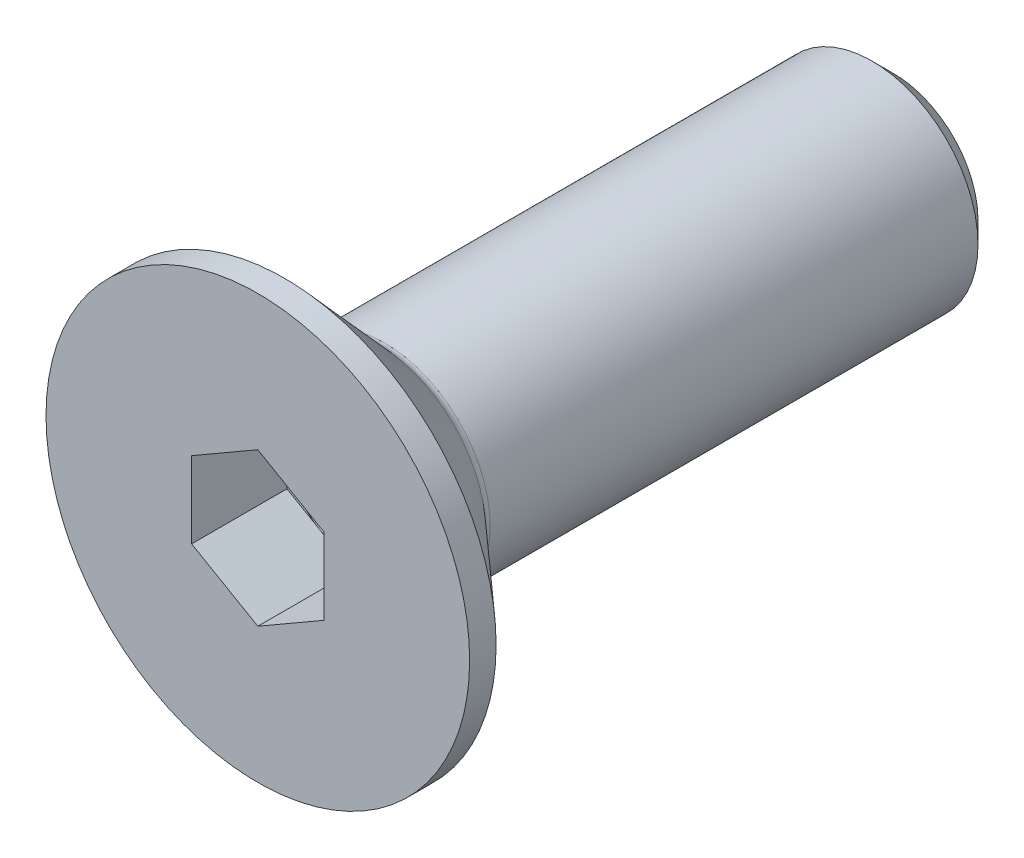
ISO-10303-21;
HEADER;
FILE_DESCRIPTION(('STEP AP214'),'2;1');
FILE_NAME('part.step','',(''),(''),'','','');
FILE_SCHEMA(('AUTOMOTIVE_DESIGN { 1 0 10303 214 1 1 1 1 }'));
ENDSEC;
DATA;
#1=APPLICATION_CONTEXT('core data for automotive mechanical design processes');
#2=APPLICATION_PROTOCOL_DEFINITION('international standard','automotive_design',2000,#1);
#3=PRODUCT_CONTEXT('',#1,'mechanical');
#4=PRODUCT('Part','Part','',(#3));
#5=PRODUCT_RELATED_PRODUCT_CATEGORY('part','',(#4));
#6=PRODUCT_DEFINITION_FORMATION('','',#4);
#7=PRODUCT_DEFINITION_CONTEXT('part definition',#1,'design');
#8=PRODUCT_DEFINITION('design','',#6,#7);
#9=PRODUCT_DEFINITION_SHAPE('','',#8);
#10=(LENGTH_UNIT() NAMED_UNIT(*) SI_UNIT(.MILLI.,.METRE.));
#11=(NAMED_UNIT(*) PLANE_ANGLE_UNIT() SI_UNIT($,.RADIAN.));
#12=(NAMED_UNIT(*) SI_UNIT($,.STERADIAN.) SOLID_ANGLE_UNIT());
#13=UNCERTAINTY_MEASURE_WITH_UNIT(LENGTH_MEASURE(1.E-05),#10,'distance_accuracy_value','');
#14=(GEOMETRIC_REPRESENTATION_CONTEXT(3) GLOBAL_UNCERTAINTY_ASSIGNED_CONTEXT((#13)) GLOBAL_UNIT_ASSIGNED_CONTEXT((#10,
#11,#12)) REPRESENTATION_CONTEXT('',''));
#15=CARTESIAN_POINT('',(0.,0.,0.));
#16=DIRECTION('',(0.,0.,1.));
#17=DIRECTION('',(1.,0.,0.));
#18=AXIS2_PLACEMENT_3D('',#15,#16,#17);
#19=CARTESIAN_POINT('',(-1.25,-0.721687836487032,-1.8));
#20=DIRECTION('',(0.,0.,1.));
#21=DIRECTION('',(1.,0.,0.));
#22=AXIS2_PLACEMENT_3D('',#19,#20,#21);
#23=PLANE('',#22);
#24=CARTESIAN_POINT('',(0.,0.,-1.8));
#25=DIRECTION('',(0.,0.,1.));
#26=DIRECTION('',(1.,0.,0.));
#27=AXIS2_PLACEMENT_3D('',#24,#25,#26);
#28=CIRCLE('',#27,1.25);
#29=CARTESIAN_POINT('',(1.25,0.,-1.8));
#30=VERTEX_POINT('',#29);
#31=CARTESIAN_POINT('',(0.624999999999999,1.08253175473055,-1.8));
#32=VERTEX_POINT('',#31);
#33=EDGE_CURVE('E112',#30,#32,#28,.T.);
#34=ORIENTED_EDGE('',*,*,#33,.F.);
#35=DIRECTION('',(0.,1.,0.));
#36=VECTOR('',#35,1.);
#37=CARTESIAN_POINT('',(1.25,-0.721687836487032,-1.8));
#38=LINE('',#37,#36);
#39=CARTESIAN_POINT('',(1.25,0.721687836487033,-1.8));
#40=VERTEX_POINT('',#39);
#41=EDGE_CURVE('E139',#30,#40,#38,.T.);
#42=ORIENTED_EDGE('',*,*,#41,.T.);
#43=DIRECTION('',(-0.866025403784439,0.5,0.));
#44=VECTOR('',#43,1.);
#45=CARTESIAN_POINT('',(1.25,0.721687836487033,-1.8));
#46=LINE('',#45,#44);
#47=EDGE_CURVE('E135',#40,#32,#46,.T.);
#48=ORIENTED_EDGE('',*,*,#47,.T.);
#49=EDGE_LOOP('',(#34,#42,#48));
#50=FACE_BOUND('',#49,.T.);
#51=ADVANCED_FACE('F34',(#50),#23,.T.);
#52=CARTESIAN_POINT('',(0.,0.,-1.8));
#53=DIRECTION('',(0.,0.,1.));
#54=DIRECTION('',(1.,0.,0.));
#55=AXIS2_PLACEMENT_3D('',#52,#53,#54);
#56=CIRCLE('',#55,1.25);
#57=CARTESIAN_POINT('',(-0.624999999999999,1.08253175473055,-1.8));
#58=VERTEX_POINT('',#57);
#59=EDGE_CURVE('E114',#32,#58,#56,.T.);
#60=ORIENTED_EDGE('',*,*,#59,.F.);
#61=CARTESIAN_POINT('',(0.,1.44337567297406,-1.8));
#62=VERTEX_POINT('',#61);
#63=EDGE_CURVE('E125',#32,#62,#46,.T.);
#64=ORIENTED_EDGE('',*,*,#63,.T.);
#65=DIRECTION('',(-0.866025403784439,-0.5,0.));
#66=VECTOR('',#65,1.);
#67=CARTESIAN_POINT('',(0.,1.44337567297406,-1.8));
#68=LINE('',#67,#66);
#69=EDGE_CURVE('E128',#62,#58,#68,.T.);
#70=ORIENTED_EDGE('',*,*,#69,.T.);
#71=EDGE_LOOP('',(#60,#64,#70));
#72=FACE_BOUND('',#71,.T.);
#73=ADVANCED_FACE('F124',(#72),#23,.T.);
#74=CARTESIAN_POINT('',(-1.25,0.,-1.8));
#75=VERTEX_POINT('',#74);
#76=EDGE_CURVE('E129',#58,#75,#56,.T.);
#77=ORIENTED_EDGE('',*,*,#76,.F.);
#78=CARTESIAN_POINT('',(-1.25,0.721687836487033,-1.8));
#79=VERTEX_POINT('',#78);
#80=EDGE_CURVE('E141',#58,#79,#68,.T.);
#81=ORIENTED_EDGE('',*,*,#80,.T.);
#82=DIRECTION('',(0.,-1.,0.));
#83=VECTOR('',#82,1.);
#84=CARTESIAN_POINT('',(-1.25,0.721687836487033,-1.8));
#85=LINE('',#84,#83);
#86=EDGE_CURVE('E234',#79,#75,#85,.T.);
#87=ORIENTED_EDGE('',*,*,#86,.T.);
#88=EDGE_LOOP('',(#77,#81,#87));
#89=FACE_BOUND('',#88,.T.);
#90=ADVANCED_FACE('F200',(#89),#23,.T.);
#91=CARTESIAN_POINT('',(-0.625,-1.08253175473055,-1.8));
#92=VERTEX_POINT('',#91);
#93=EDGE_CURVE('E230',#75,#92,#56,.T.);
#94=ORIENTED_EDGE('',*,*,#93,.F.);
#95=CARTESIAN_POINT('',(-1.25,-0.721687836487032,-1.8));
#96=VERTEX_POINT('',#95);
#97=EDGE_CURVE('E162',#75,#96,#85,.T.);
#98=ORIENTED_EDGE('',*,*,#97,.T.);
#99=DIRECTION('',(0.866025403784439,-0.5,0.));
#100=VECTOR('',#99,1.);
#101=CARTESIAN_POINT('',(-1.25,-0.721687836487032,-1.8));
#102=LINE('',#101,#100);
#103=EDGE_CURVE('E233',#96,#92,#102,.T.);
#104=ORIENTED_EDGE('',*,*,#103,.T.);
#105=EDGE_LOOP('',(#94,#98,#104));
#106=FACE_BOUND('',#105,.T.);
#107=ADVANCED_FACE('F214',(#106),#23,.T.);
#108=CARTESIAN_POINT('',(0.625000000000001,-1.08253175473055,-1.8));
#109=VERTEX_POINT('',#108);
#110=EDGE_CURVE('E49',#92,#109,#56,.T.);
#111=ORIENTED_EDGE('',*,*,#110,.F.);
#112=CARTESIAN_POINT('',(0.,-1.44337567297406,-1.8));
#113=VERTEX_POINT('',#112);
#114=EDGE_CURVE('E226',#92,#113,#102,.T.);
#115=ORIENTED_EDGE('',*,*,#114,.T.);
#116=DIRECTION('',(0.866025403784439,0.5,0.));
#117=VECTOR('',#116,1.);
#118=CARTESIAN_POINT('',(0.,-1.44337567297406,-1.8));
#119=LINE('',#118,#117);
#120=EDGE_CURVE('E229',#113,#109,#119,.T.);
#121=ORIENTED_EDGE('',*,*,#120,.T.);
#122=EDGE_LOOP('',(#111,#115,#121));
#123=FACE_BOUND('',#122,.T.);
#124=ADVANCED_FACE('F205',(#123),#23,.T.);
#125=CARTESIAN_POINT('',(0.,0.,0.));
#126=DIRECTION('',(0.,0.,1.));
#127=DIRECTION('',(1.,0.,0.));
#128=AXIS2_PLACEMENT_3D('',#125,#126,#127);
#129=CYLINDRICAL_SURFACE('',#128,4.);
#130=CARTESIAN_POINT('',(0.,0.,0.));
#131=DIRECTION('',(0.,0.,1.));
#132=DIRECTION('',(1.,0.,0.));
#133=AXIS2_PLACEMENT_3D('',#130,#131,#132);
#134=CIRCLE('',#133,4.);
#135=CARTESIAN_POINT('',(4.,0.,0.));
#136=VERTEX_POINT('',#135);
#137=EDGE_CURVE('E176',#136,#136,#134,.T.);
#138=ORIENTED_EDGE('',*,*,#137,.F.);
#139=EDGE_LOOP('',(#138));
#140=FACE_BOUND('',#139,.T.);
#141=CARTESIAN_POINT('',(0.,0.,-0.5));
#142=DIRECTION('',(0.,0.,1.));
#143=DIRECTION('',(1.,0.,0.));
#144=AXIS2_PLACEMENT_3D('',#141,#142,#143);
#145=CIRCLE('',#144,4.);
#146=CARTESIAN_POINT('',(4.,0.,-0.5));
#147=VERTEX_POINT('',#146);
#148=EDGE_CURVE('E165',#147,#147,#145,.T.);
#149=ORIENTED_EDGE('',*,*,#148,.T.);
#150=EDGE_LOOP('',(#149));
#151=FACE_BOUND('',#150,.T.);
#152=ADVANCED_FACE('F213',(#140,#151),#129,.T.);
#153=CARTESIAN_POINT('',(0.,4.,0.));
#154=DIRECTION('',(0.,0.,-1.));
#155=DIRECTION('',(-1.,0.,0.));
#156=AXIS2_PLACEMENT_3D('',#153,#154,#155);
#157=PLANE('',#156);
#158=DIRECTION('',(0.866025403784439,-0.5,0.));
#159=VECTOR('',#158,1.);
#160=CARTESIAN_POINT('',(-1.25,-0.721687836487032,0.));
#161=LINE('',#160,#159);
#162=CARTESIAN_POINT('',(-1.25,-0.721687836487032,0.));
#163=VERTEX_POINT('',#162);
#164=CARTESIAN_POINT('',(0.,-1.44337567297406,0.));
#165=VERTEX_POINT('',#164);
#166=EDGE_CURVE('E148',#163,#165,#161,.T.);
#167=ORIENTED_EDGE('',*,*,#166,.F.);
#168=DIRECTION('',(0.,-1.,0.));
#169=VECTOR('',#168,1.);
#170=CARTESIAN_POINT('',(-1.25,0.721687836487033,0.));
#171=LINE('',#170,#169);
#172=CARTESIAN_POINT('',(-1.25,0.721687836487033,0.));
#173=VERTEX_POINT('',#172);
#174=EDGE_CURVE('E57',#173,#163,#171,.T.);
#175=ORIENTED_EDGE('',*,*,#174,.F.);
#176=DIRECTION('',(-0.866025403784439,-0.5,0.));
#177=VECTOR('',#176,1.);
#178=CARTESIAN_POINT('',(0.,1.44337567297406,0.));
#179=LINE('',#178,#177);
#180=CARTESIAN_POINT('',(0.,1.44337567297406,0.));
#181=VERTEX_POINT('',#180);
#182=EDGE_CURVE('E159',#181,#173,#179,.T.);
#183=ORIENTED_EDGE('',*,*,#182,.F.);
#184=DIRECTION('',(-0.866025403784439,0.5,0.));
#185=VECTOR('',#184,1.);
#186=CARTESIAN_POINT('',(1.25,0.721687836487033,0.));
#187=LINE('',#186,#185);
#188=CARTESIAN_POINT('',(1.25,0.721687836487033,0.));
#189=VERTEX_POINT('',#188);
#190=EDGE_CURVE('E157',#189,#181,#187,.T.);
#191=ORIENTED_EDGE('',*,*,#190,.F.);
#192=DIRECTION('',(0.,1.,0.));
#193=VECTOR('',#192,1.);
#194=CARTESIAN_POINT('',(1.25,-0.721687836487032,0.));
#195=LINE('',#194,#193);
#196=CARTESIAN_POINT('',(1.25,-0.721687836487032,0.));
#197=VERTEX_POINT('',#196);
#198=EDGE_CURVE('E154',#197,#189,#195,.T.);
#199=ORIENTED_EDGE('',*,*,#198,.F.);
#200=DIRECTION('',(0.866025403784439,0.5,0.));
#201=VECTOR('',#200,1.);
#202=CARTESIAN_POINT('',(0.,-1.44337567297406,0.));
#203=LINE('',#202,#201);
#204=EDGE_CURVE('E151',#165,#197,#203,.T.);
#205=ORIENTED_EDGE('',*,*,#204,.F.);
#206=EDGE_LOOP('',(#167,#175,#183,#191,#199,#205));
#207=FACE_BOUND('',#206,.T.);
#208=ORIENTED_EDGE('',*,*,#137,.T.);
#209=EDGE_LOOP('',(#208));
#210=FACE_BOUND('',#209,.T.);
#211=ADVANCED_FACE('F220',(#207,#210),#157,.F.);
#212=CARTESIAN_POINT('',(0.,0.,-12.));
#213=DIRECTION('',(0.,0.,1.));
#214=DIRECTION('',(1.,0.,0.));
#215=AXIS2_PLACEMENT_3D('',#212,#213,#214);
#216=PLANE('',#215);
#217=CARTESIAN_POINT('',(0.,0.,-12.));
#218=DIRECTION('',(0.,0.,1.));
#219=DIRECTION('',(1.,0.,0.));
#220=AXIS2_PLACEMENT_3D('',#217,#218,#219);
#221=CIRCLE('',#220,1.6);
#222=CARTESIAN_POINT('',(1.6,0.,-12.));
#223=VERTEX_POINT('',#222);
#224=EDGE_CURVE('E182',#223,#223,#221,.F.);
#225=ORIENTED_EDGE('',*,*,#224,.T.);
#226=EDGE_LOOP('',(#225));
#227=FACE_BOUND('',#226,.T.);
#228=ADVANCED_FACE('F278',(#227),#216,.F.);
#229=CARTESIAN_POINT('',(0.,0.,0.));
#230=DIRECTION('',(0.,0.,1.));
#231=DIRECTION('',(1.,0.,0.));
#232=AXIS2_PLACEMENT_3D('',#229,#230,#231);
#233=CYLINDRICAL_SURFACE('',#232,2.);
#234=CARTESIAN_POINT('',(0.,0.,-2.38907248094147));
#235=DIRECTION('',(0.,0.,1.));
#236=DIRECTION('',(1.,0.,0.));
#237=AXIS2_PLACEMENT_3D('',#234,#235,#236);
#238=CIRCLE('',#237,2.);
#239=CARTESIAN_POINT('',(2.,0.,-2.38907248094147));
#240=VERTEX_POINT('',#239);
#241=EDGE_CURVE('E11',#240,#240,#238,.F.);
#242=ORIENTED_EDGE('',*,*,#241,.T.);
#243=EDGE_LOOP('',(#242));
#244=FACE_BOUND('',#243,.T.);
#245=CARTESIAN_POINT('',(0.,0.,-11.6));
#246=DIRECTION('',(0.,0.,1.));
#247=DIRECTION('',(1.,0.,0.));
#248=AXIS2_PLACEMENT_3D('',#245,#246,#247);
#249=CIRCLE('',#248,2.);
#250=CARTESIAN_POINT('',(2.,0.,-11.6));
#251=VERTEX_POINT('',#250);
#252=EDGE_CURVE('E179',#251,#251,#249,.T.);
#253=ORIENTED_EDGE('',*,*,#252,.T.);
#254=EDGE_LOOP('',(#253));
#255=FACE_BOUND('',#254,.T.);
#256=ADVANCED_FACE('F275',(#244,#255),#233,.T.);
#257=CARTESIAN_POINT('',(0.,0.,-2.3));
#258=DIRECTION('',(0.,0.,1.));
#259=DIRECTION('',(1.,0.,0.));
#260=AXIS2_PLACEMENT_3D('',#257,#258,#259);
#261=CONICAL_SURFACE('',#260,2.,0.83798122500839);
#262=CARTESIAN_POINT('',(0.,0.,-2.24041365169204));
#263=DIRECTION('',(0.,0.,1.));
#264=DIRECTION('',(1.,0.,0.));
#265=AXIS2_PLACEMENT_3D('',#262,#263,#264);
#266=CIRCLE('',#265,2.06620705367551);
#267=CARTESIAN_POINT('',(2.06620705367551,0.,-2.24041365169204));
#268=VERTEX_POINT('',#267);
#269=EDGE_CURVE('E42',#268,#268,#266,.T.);
#270=ORIENTED_EDGE('',*,*,#269,.T.);
#271=EDGE_LOOP('',(#270));
#272=FACE_BOUND('',#271,.T.);
#273=ORIENTED_EDGE('',*,*,#148,.F.);
#274=EDGE_LOOP('',(#273));
#275=FACE_BOUND('',#274,.T.);
#276=ADVANCED_FACE('F187',(#272,#275),#261,.T.);
#277=CARTESIAN_POINT('',(0.,0.,-11.6));
#278=DIRECTION('',(0.,0.,1.));
#279=DIRECTION('',(1.,0.,0.));
#280=AXIS2_PLACEMENT_3D('',#277,#278,#279);
#281=CONICAL_SURFACE('',#280,2.,0.785398163397451);
#282=ORIENTED_EDGE('',*,*,#224,.F.);
#283=EDGE_LOOP('',(#282));
#284=FACE_BOUND('',#283,.T.);
#285=ORIENTED_EDGE('',*,*,#252,.F.);
#286=EDGE_LOOP('',(#285));
#287=FACE_BOUND('',#286,.T.);
#288=ADVANCED_FACE('F272',(#284,#287),#281,.T.);
#289=CARTESIAN_POINT('',(-1.25,0.721687836487033,-1.8));
#290=DIRECTION('',(-1.,0.,0.));
#291=DIRECTION('',(0.,-1.,0.));
#292=AXIS2_PLACEMENT_3D('',#289,#290,#291);
#293=PLANE('',#292);
#294=ORIENTED_EDGE('',*,*,#174,.T.);
#295=DIRECTION('',(0.,0.,1.));
#296=VECTOR('',#295,1.);
#297=CARTESIAN_POINT('',(-1.25,-0.721687836487032,-1.8));
#298=LINE('',#297,#296);
#299=EDGE_CURVE('E146',#96,#163,#298,.T.);
#300=ORIENTED_EDGE('',*,*,#299,.F.);
#301=ORIENTED_EDGE('',*,*,#97,.F.);
#302=ORIENTED_EDGE('',*,*,#86,.F.);
#303=DIRECTION('',(0.,0.,1.));
#304=VECTOR('',#303,1.);
#305=CARTESIAN_POINT('',(-1.25,0.721687836487033,-1.8));
#306=LINE('',#305,#304);
#307=EDGE_CURVE('E163',#79,#173,#306,.T.);
#308=ORIENTED_EDGE('',*,*,#307,.T.);
#309=EDGE_LOOP('',(#294,#300,#301,#302,#308));
#310=FACE_BOUND('',#309,.T.);
#311=ADVANCED_FACE('F259',(#310),#293,.F.);
#312=CARTESIAN_POINT('',(0.,1.44337567297406,-1.8));
#313=DIRECTION('',(-0.5,0.866025403784439,0.));
#314=DIRECTION('',(-0.866025403784439,-0.5,0.));
#315=AXIS2_PLACEMENT_3D('',#312,#313,#314);
#316=PLANE('',#315);
#317=ORIENTED_EDGE('',*,*,#182,.T.);
#318=ORIENTED_EDGE('',*,*,#307,.F.);
#319=ORIENTED_EDGE('',*,*,#80,.F.);
#320=ORIENTED_EDGE('',*,*,#69,.F.);
#321=DIRECTION('',(0.,0.,1.));
#322=VECTOR('',#321,1.);
#323=CARTESIAN_POINT('',(0.,1.44337567297406,-1.8));
#324=LINE('',#323,#322);
#325=EDGE_CURVE('E136',#62,#181,#324,.T.);
#326=ORIENTED_EDGE('',*,*,#325,.T.);
#327=EDGE_LOOP('',(#317,#318,#319,#320,#326));
#328=FACE_BOUND('',#327,.T.);
#329=ADVANCED_FACE('F254',(#328),#316,.F.);
#330=CARTESIAN_POINT('',(1.25,0.721687836487033,-1.8));
#331=DIRECTION('',(0.5,0.866025403784439,0.));
#332=DIRECTION('',(-0.866025403784439,0.5,0.));
#333=AXIS2_PLACEMENT_3D('',#330,#331,#332);
#334=PLANE('',#333);
#335=ORIENTED_EDGE('',*,*,#190,.T.);
#336=ORIENTED_EDGE('',*,*,#325,.F.);
#337=ORIENTED_EDGE('',*,*,#63,.F.);
#338=ORIENTED_EDGE('',*,*,#47,.F.);
#339=DIRECTION('',(0.,0.,1.));
#340=VECTOR('',#339,1.);
#341=CARTESIAN_POINT('',(1.25,0.721687836487033,-1.8));
#342=LINE('',#341,#340);
#343=EDGE_CURVE('E167',#40,#189,#342,.T.);
#344=ORIENTED_EDGE('',*,*,#343,.T.);
#345=EDGE_LOOP('',(#335,#336,#337,#338,#344));
#346=FACE_BOUND('',#345,.T.);
#347=ADVANCED_FACE('F134',(#346),#334,.F.);
#348=CARTESIAN_POINT('',(1.25,-0.721687836487032,-1.8));
#349=DIRECTION('',(1.,0.,0.));
#350=DIRECTION('',(0.,1.,0.));
#351=AXIS2_PLACEMENT_3D('',#348,#349,#350);
#352=PLANE('',#351);
#353=ORIENTED_EDGE('',*,*,#198,.T.);
#354=ORIENTED_EDGE('',*,*,#343,.F.);
#355=ORIENTED_EDGE('',*,*,#41,.F.);
#356=CARTESIAN_POINT('',(1.25,-0.721687836487032,-1.8));
#357=VERTEX_POINT('',#356);
#358=EDGE_CURVE('E137',#357,#30,#38,.T.);
#359=ORIENTED_EDGE('',*,*,#358,.F.);
#360=DIRECTION('',(0.,0.,1.));
#361=VECTOR('',#360,1.);
#362=CARTESIAN_POINT('',(1.25,-0.721687836487032,-1.8));
#363=LINE('',#362,#361);
#364=EDGE_CURVE('E169',#357,#197,#363,.T.);
#365=ORIENTED_EDGE('',*,*,#364,.T.);
#366=EDGE_LOOP('',(#353,#354,#355,#359,#365));
#367=FACE_BOUND('',#366,.T.);
#368=ADVANCED_FACE('F245',(#367),#352,.F.);
#369=CARTESIAN_POINT('',(0.,-1.44337567297406,-1.8));
#370=DIRECTION('',(0.5,-0.866025403784439,0.));
#371=DIRECTION('',(0.866025403784439,0.5,0.));
#372=AXIS2_PLACEMENT_3D('',#369,#370,#371);
#373=PLANE('',#372);
#374=ORIENTED_EDGE('',*,*,#204,.T.);
#375=ORIENTED_EDGE('',*,*,#364,.F.);
#376=EDGE_CURVE('E238',#109,#357,#119,.T.);
#377=ORIENTED_EDGE('',*,*,#376,.F.);
#378=ORIENTED_EDGE('',*,*,#120,.F.);
#379=DIRECTION('',(0.,0.,1.));
#380=VECTOR('',#379,1.);
#381=CARTESIAN_POINT('',(0.,-1.44337567297406,-1.8));
#382=LINE('',#381,#380);
#383=EDGE_CURVE('E171',#113,#165,#382,.T.);
#384=ORIENTED_EDGE('',*,*,#383,.T.);
#385=EDGE_LOOP('',(#374,#375,#377,#378,#384));
#386=FACE_BOUND('',#385,.T.);
#387=ADVANCED_FACE('F209',(#386),#373,.F.);
#388=CARTESIAN_POINT('',(-1.25,-0.721687836487032,-1.8));
#389=DIRECTION('',(-0.5,-0.866025403784439,0.));
#390=DIRECTION('',(0.866025403784439,-0.5,0.));
#391=AXIS2_PLACEMENT_3D('',#388,#389,#390);
#392=PLANE('',#391);
#393=ORIENTED_EDGE('',*,*,#166,.T.);
#394=ORIENTED_EDGE('',*,*,#383,.F.);
#395=ORIENTED_EDGE('',*,*,#114,.F.);
#396=ORIENTED_EDGE('',*,*,#103,.F.);
#397=ORIENTED_EDGE('',*,*,#299,.T.);
#398=EDGE_LOOP('',(#393,#394,#395,#396,#397));
#399=FACE_BOUND('',#398,.T.);
#400=ADVANCED_FACE('F203',(#399),#392,.F.);
#401=EDGE_CURVE('E116',#109,#30,#56,.T.);
#402=ORIENTED_EDGE('',*,*,#401,.F.);
#403=ORIENTED_EDGE('',*,*,#376,.T.);
#404=ORIENTED_EDGE('',*,*,#358,.T.);
#405=EDGE_LOOP('',(#402,#403,#404));
#406=FACE_BOUND('',#405,.T.);
#407=ADVANCED_FACE('F109',(#406),#23,.T.);
#408=CARTESIAN_POINT('',(0.,0.,-1.8));
#409=DIRECTION('',(0.,0.,1.));
#410=DIRECTION('',(1.,0.,0.));
#411=AXIS2_PLACEMENT_3D('',#408,#409,#410);
#412=CONICAL_SURFACE('',#411,1.25,1.20427718387609);
#413=CARTESIAN_POINT('',(0.,0.,-2.27983004379427));
#414=VERTEX_POINT('',#413);
#415=VERTEX_LOOP('',#414);
#416=FACE_BOUND('',#415,.T.);
#417=ORIENTED_EDGE('',*,*,#33,.T.);
#418=ORIENTED_EDGE('',*,*,#59,.T.);
#419=ORIENTED_EDGE('',*,*,#76,.T.);
#420=ORIENTED_EDGE('',*,*,#93,.T.);
#421=ORIENTED_EDGE('',*,*,#110,.T.);
#422=ORIENTED_EDGE('',*,*,#401,.T.);
#423=EDGE_LOOP('',(#417,#418,#419,#420,#421,#422));
#424=FACE_BOUND('',#423,.T.);
#425=ADVANCED_FACE('F107',(#416,#424),#412,.F.);
#426=CARTESIAN_POINT('',(0.,0.,-2.38907248094147));
#427=DIRECTION('',(0.,0.,1.));
#428=DIRECTION('',(1.,0.,0.));
#429=AXIS2_PLACEMENT_3D('',#426,#427,#428);
#430=TOROIDAL_SURFACE('',#429,2.2,0.2);
#431=ORIENTED_EDGE('',*,*,#241,.F.);
#432=EDGE_LOOP('',(#431));
#433=FACE_BOUND('',#432,.T.);
#434=ORIENTED_EDGE('',*,*,#269,.F.);
#435=EDGE_LOOP('',(#434));
#436=FACE_BOUND('',#435,.T.);
#437=ADVANCED_FACE('F36',(#433,#436),#430,.F.);
#438=CLOSED_SHELL('',(#51,#73,#90,#107,#124,#152,#211,#228,#256,#276,#288,#311,#329,#347,#368,
#387,#400,#407,#425,#437));
#439=MANIFOLD_SOLID_BREP('B2',#438);
#440=ADVANCED_BREP_SHAPE_REPRESENTATION('',(#18,#439),#14);
#441=SHAPE_DEFINITION_REPRESENTATION(#9,#440);
ENDSEC;
END-ISO-10303-21;
